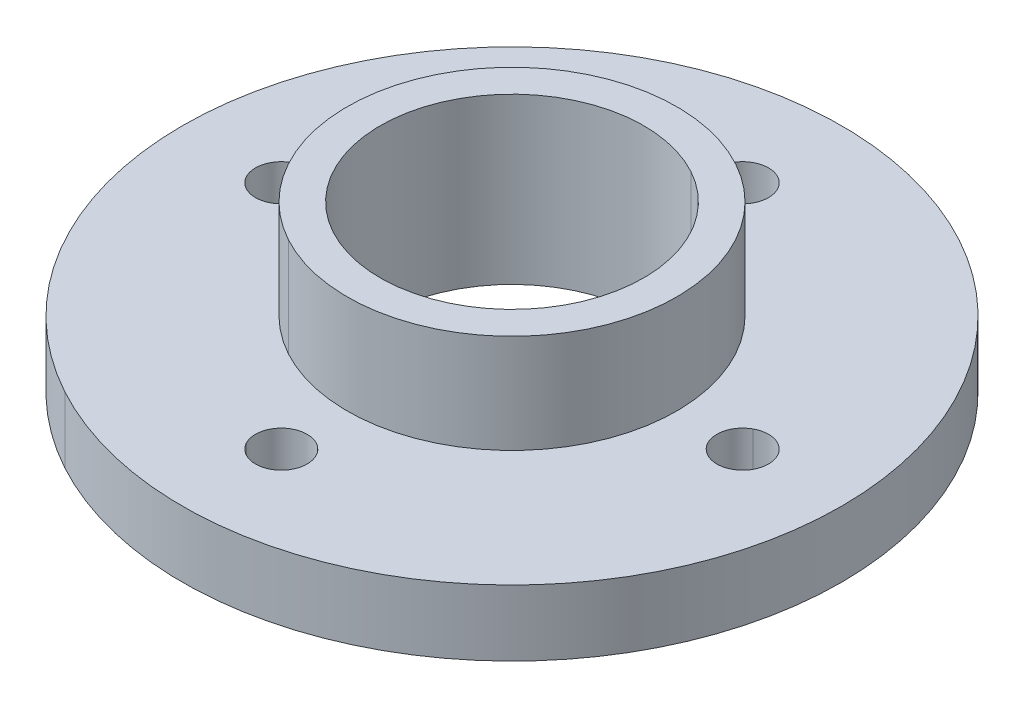
ISO-10303-21;
HEADER;
FILE_DESCRIPTION(('STEP AP214'),'2;1');
FILE_NAME('part.step','',(''),(''),'','','');
FILE_SCHEMA(('AUTOMOTIVE_DESIGN { 1 0 10303 214 1 1 1 1 }'));
ENDSEC;
DATA;
#1=APPLICATION_CONTEXT('core data for automotive mechanical design processes');
#2=APPLICATION_PROTOCOL_DEFINITION('international standard','automotive_design',2000,#1);
#3=PRODUCT_CONTEXT('',#1,'mechanical');
#4=PRODUCT('Part','Part','',(#3));
#5=PRODUCT_RELATED_PRODUCT_CATEGORY('part','',(#4));
#6=PRODUCT_DEFINITION_FORMATION('','',#4);
#7=PRODUCT_DEFINITION_CONTEXT('part definition',#1,'design');
#8=PRODUCT_DEFINITION('design','',#6,#7);
#9=PRODUCT_DEFINITION_SHAPE('','',#8);
#10=(LENGTH_UNIT() NAMED_UNIT(*) SI_UNIT(.MILLI.,.METRE.));
#11=(NAMED_UNIT(*) PLANE_ANGLE_UNIT() SI_UNIT($,.RADIAN.));
#12=(NAMED_UNIT(*) SI_UNIT($,.STERADIAN.) SOLID_ANGLE_UNIT());
#13=UNCERTAINTY_MEASURE_WITH_UNIT(LENGTH_MEASURE(1.E-05),#10,'distance_accuracy_value','');
#14=(GEOMETRIC_REPRESENTATION_CONTEXT(3) GLOBAL_UNCERTAINTY_ASSIGNED_CONTEXT((#13)) GLOBAL_UNIT_ASSIGNED_CONTEXT((#10,
#11,#12)) REPRESENTATION_CONTEXT('',''));
#15=CARTESIAN_POINT('',(0.,0.,0.));
#16=DIRECTION('',(0.,0.,1.));
#17=DIRECTION('',(1.,0.,0.));
#18=AXIS2_PLACEMENT_3D('',#15,#16,#17);
#19=CARTESIAN_POINT('',(7.,0.1,0.));
#20=DIRECTION('',(0.,-1.,0.));
#21=DIRECTION('',(0.,0.,-1.));
#22=AXIS2_PLACEMENT_3D('',#19,#20,#21);
#23=CYLINDRICAL_SURFACE('',#22,0.7835);
#24=DIRECTION('',(0.,-1.,0.));
#25=VECTOR('',#24,1.);
#26=CARTESIAN_POINT('',(6.62437009050361,1.34499999997,-0.687585937241108));
#27=LINE('',#26,#25);
#28=CARTESIAN_POINT('',(6.62437009050361,2.,-0.687585937241108));
#29=VERTEX_POINT('',#28);
#30=CARTESIAN_POINT('',(6.62437009050361,0.,-0.687585937241108));
#31=VERTEX_POINT('',#30);
#32=EDGE_CURVE('E11',#29,#31,#27,.T.);
#33=ORIENTED_EDGE('',*,*,#32,.F.);
#34=CARTESIAN_POINT('',(7.,2.,0.));
#35=DIRECTION('',(0.,-1.,0.));
#36=DIRECTION('',(1.,0.,0.));
#37=AXIS2_PLACEMENT_3D('',#34,#35,#36);
#38=CIRCLE('',#37,0.7835);
#39=CARTESIAN_POINT('',(7.37562990949639,2.,0.687585937241106));
#40=VERTEX_POINT('',#39);
#41=EDGE_CURVE('E295',#40,#29,#38,.T.);
#42=ORIENTED_EDGE('',*,*,#41,.F.);
#43=DIRECTION('',(0.,-1.,0.));
#44=VECTOR('',#43,1.);
#45=CARTESIAN_POINT('',(7.37562990949639,1.34499999997,0.687585937241106));
#46=LINE('',#45,#44);
#47=CARTESIAN_POINT('',(7.37562990949639,0.,0.687585937241106));
#48=VERTEX_POINT('',#47);
#49=EDGE_CURVE('E26',#40,#48,#46,.T.);
#50=ORIENTED_EDGE('',*,*,#49,.T.);
#51=CARTESIAN_POINT('',(7.,0.,0.));
#52=DIRECTION('',(0.,-1.,0.));
#53=DIRECTION('',(1.,0.,0.));
#54=AXIS2_PLACEMENT_3D('',#51,#52,#53);
#55=CIRCLE('',#54,0.7835);
#56=EDGE_CURVE('E189',#48,#31,#55,.T.);
#57=ORIENTED_EDGE('',*,*,#56,.T.);
#58=EDGE_LOOP('',(#33,#42,#50,#57));
#59=FACE_BOUND('',#58,.T.);
#60=ADVANCED_FACE('F18',(#59),#23,.F.);
#61=CARTESIAN_POINT('',(7.,0.1,0.));
#62=DIRECTION('',(0.,-1.,0.));
#63=DIRECTION('',(0.,0.,-1.));
#64=AXIS2_PLACEMENT_3D('',#61,#62,#63);
#65=CYLINDRICAL_SURFACE('',#64,0.7835);
#66=ORIENTED_EDGE('',*,*,#49,.F.);
#67=CARTESIAN_POINT('',(7.,2.,0.));
#68=DIRECTION('',(0.,-1.,0.));
#69=DIRECTION('',(1.,0.,0.));
#70=AXIS2_PLACEMENT_3D('',#67,#68,#69);
#71=CIRCLE('',#70,0.7835);
#72=EDGE_CURVE('E299',#29,#40,#71,.T.);
#73=ORIENTED_EDGE('',*,*,#72,.F.);
#74=ORIENTED_EDGE('',*,*,#32,.T.);
#75=CARTESIAN_POINT('',(7.,0.,0.));
#76=DIRECTION('',(0.,-1.,0.));
#77=DIRECTION('',(1.,0.,0.));
#78=AXIS2_PLACEMENT_3D('',#75,#76,#77);
#79=CIRCLE('',#78,0.7835);
#80=EDGE_CURVE('E165',#31,#48,#79,.T.);
#81=ORIENTED_EDGE('',*,*,#80,.T.);
#82=EDGE_LOOP('',(#66,#73,#74,#81));
#83=FACE_BOUND('',#82,.T.);
#84=ADVANCED_FACE('F313',(#83),#65,.F.);
#85=CARTESIAN_POINT('',(0.,0.1,-7.));
#86=DIRECTION('',(0.,-1.,0.));
#87=DIRECTION('',(-1.,0.,0.));
#88=AXIS2_PLACEMENT_3D('',#85,#86,#87);
#89=CYLINDRICAL_SURFACE('',#88,0.7835);
#90=DIRECTION('',(0.,-1.,0.));
#91=VECTOR('',#90,1.);
#92=CARTESIAN_POINT('',(-0.687585937241107,1.34499999997,-6.62437009050361));
#93=LINE('',#92,#91);
#94=CARTESIAN_POINT('',(-0.687585937241107,2.,-6.62437009050361));
#95=VERTEX_POINT('',#94);
#96=CARTESIAN_POINT('',(-0.687585937241108,0.,-6.62437009050361));
#97=VERTEX_POINT('',#96);
#98=EDGE_CURVE('E225',#95,#97,#93,.T.);
#99=ORIENTED_EDGE('',*,*,#98,.F.);
#100=CARTESIAN_POINT('',(0.,2.,-7.));
#101=DIRECTION('',(0.,-1.,0.));
#102=DIRECTION('',(1.,0.,0.));
#103=AXIS2_PLACEMENT_3D('',#100,#101,#102);
#104=CIRCLE('',#103,0.7835);
#105=CARTESIAN_POINT('',(0.687585937241107,2.,-7.37562990949639));
#106=VERTEX_POINT('',#105);
#107=EDGE_CURVE('E287',#106,#95,#104,.T.);
#108=ORIENTED_EDGE('',*,*,#107,.F.);
#109=DIRECTION('',(0.,-1.,0.));
#110=VECTOR('',#109,1.);
#111=CARTESIAN_POINT('',(0.687585937241107,1.34499999997,-7.37562990949639));
#112=LINE('',#111,#110);
#113=CARTESIAN_POINT('',(0.687585937241107,0.,-7.37562990949639));
#114=VERTEX_POINT('',#113);
#115=EDGE_CURVE('E222',#106,#114,#112,.T.);
#116=ORIENTED_EDGE('',*,*,#115,.T.);
#117=CARTESIAN_POINT('',(0.,0.,-7.));
#118=DIRECTION('',(0.,-1.,0.));
#119=DIRECTION('',(1.,0.,0.));
#120=AXIS2_PLACEMENT_3D('',#117,#118,#119);
#121=CIRCLE('',#120,0.7835);
#122=EDGE_CURVE('E190',#114,#97,#121,.T.);
#123=ORIENTED_EDGE('',*,*,#122,.T.);
#124=EDGE_LOOP('',(#99,#108,#116,#123));
#125=FACE_BOUND('',#124,.T.);
#126=ADVANCED_FACE('F390',(#125),#89,.F.);
#127=CARTESIAN_POINT('',(0.,0.1,-7.));
#128=DIRECTION('',(0.,-1.,0.));
#129=DIRECTION('',(-1.,0.,0.));
#130=AXIS2_PLACEMENT_3D('',#127,#128,#129);
#131=CYLINDRICAL_SURFACE('',#130,0.7835);
#132=ORIENTED_EDGE('',*,*,#115,.F.);
#133=CARTESIAN_POINT('',(0.,2.,-7.));
#134=DIRECTION('',(0.,-1.,0.));
#135=DIRECTION('',(1.,0.,0.));
#136=AXIS2_PLACEMENT_3D('',#133,#134,#135);
#137=CIRCLE('',#136,0.7835);
#138=EDGE_CURVE('E291',#95,#106,#137,.T.);
#139=ORIENTED_EDGE('',*,*,#138,.F.);
#140=ORIENTED_EDGE('',*,*,#98,.T.);
#141=CARTESIAN_POINT('',(0.,0.,-7.));
#142=DIRECTION('',(0.,-1.,0.));
#143=DIRECTION('',(1.,0.,0.));
#144=AXIS2_PLACEMENT_3D('',#141,#142,#143);
#145=CIRCLE('',#144,0.7835);
#146=EDGE_CURVE('E186',#97,#114,#145,.T.);
#147=ORIENTED_EDGE('',*,*,#146,.T.);
#148=EDGE_LOOP('',(#132,#139,#140,#147));
#149=FACE_BOUND('',#148,.T.);
#150=ADVANCED_FACE('F395',(#149),#131,.F.);
#151=CARTESIAN_POINT('',(-7.,0.1,0.));
#152=DIRECTION('',(0.,-1.,0.));
#153=DIRECTION('',(0.,0.,1.));
#154=AXIS2_PLACEMENT_3D('',#151,#152,#153);
#155=CYLINDRICAL_SURFACE('',#154,0.7835);
#156=DIRECTION('',(0.,-1.,0.));
#157=VECTOR('',#156,1.);
#158=CARTESIAN_POINT('',(-6.62437009050361,1.34499999997,0.687585937241107));
#159=LINE('',#158,#157);
#160=CARTESIAN_POINT('',(-6.62437009050361,2.,0.687585937241106));
#161=VERTEX_POINT('',#160);
#162=CARTESIAN_POINT('',(-6.62437009050361,0.,0.687585937241107));
#163=VERTEX_POINT('',#162);
#164=EDGE_CURVE('E226',#161,#163,#159,.T.);
#165=ORIENTED_EDGE('',*,*,#164,.F.);
#166=CARTESIAN_POINT('',(-7.,2.,0.));
#167=DIRECTION('',(0.,-1.,0.));
#168=DIRECTION('',(1.,0.,0.));
#169=AXIS2_PLACEMENT_3D('',#166,#167,#168);
#170=CIRCLE('',#169,0.7835);
#171=CARTESIAN_POINT('',(-7.37562990949639,2.,-0.687585937241108));
#172=VERTEX_POINT('',#171);
#173=EDGE_CURVE('E204',#172,#161,#170,.T.);
#174=ORIENTED_EDGE('',*,*,#173,.F.);
#175=DIRECTION('',(0.,-1.,0.));
#176=VECTOR('',#175,1.);
#177=CARTESIAN_POINT('',(-7.37562990949639,1.34499999997,-0.687585937241107));
#178=LINE('',#177,#176);
#179=CARTESIAN_POINT('',(-7.37562990949639,0.,-0.687585937241107));
#180=VERTEX_POINT('',#179);
#181=EDGE_CURVE('E302',#172,#180,#178,.T.);
#182=ORIENTED_EDGE('',*,*,#181,.T.);
#183=CARTESIAN_POINT('',(-7.,0.,0.));
#184=DIRECTION('',(0.,-1.,0.));
#185=DIRECTION('',(1.,0.,0.));
#186=AXIS2_PLACEMENT_3D('',#183,#184,#185);
#187=CIRCLE('',#186,0.7835);
#188=EDGE_CURVE('E196',#180,#163,#187,.T.);
#189=ORIENTED_EDGE('',*,*,#188,.T.);
#190=EDGE_LOOP('',(#165,#174,#182,#189));
#191=FACE_BOUND('',#190,.T.);
#192=ADVANCED_FACE('F379',(#191),#155,.F.);
#193=CARTESIAN_POINT('',(-7.,0.1,0.));
#194=DIRECTION('',(0.,-1.,0.));
#195=DIRECTION('',(0.,0.,1.));
#196=AXIS2_PLACEMENT_3D('',#193,#194,#195);
#197=CYLINDRICAL_SURFACE('',#196,0.7835);
#198=ORIENTED_EDGE('',*,*,#181,.F.);
#199=CARTESIAN_POINT('',(-7.,2.,0.));
#200=DIRECTION('',(0.,-1.,0.));
#201=DIRECTION('',(1.,0.,0.));
#202=AXIS2_PLACEMENT_3D('',#199,#200,#201);
#203=CIRCLE('',#202,0.7835);
#204=EDGE_CURVE('E208',#161,#172,#203,.T.);
#205=ORIENTED_EDGE('',*,*,#204,.F.);
#206=ORIENTED_EDGE('',*,*,#164,.T.);
#207=CARTESIAN_POINT('',(-7.,0.,0.));
#208=DIRECTION('',(0.,-1.,0.));
#209=DIRECTION('',(1.,0.,0.));
#210=AXIS2_PLACEMENT_3D('',#207,#208,#209);
#211=CIRCLE('',#210,0.7835);
#212=EDGE_CURVE('E192',#163,#180,#211,.T.);
#213=ORIENTED_EDGE('',*,*,#212,.T.);
#214=EDGE_LOOP('',(#198,#205,#206,#213));
#215=FACE_BOUND('',#214,.T.);
#216=ADVANCED_FACE('F368',(#215),#197,.F.);
#217=CARTESIAN_POINT('',(0.,2.,10.));
#218=DIRECTION('',(0.,-1.,0.));
#219=DIRECTION('',(1.,0.,0.));
#220=AXIS2_PLACEMENT_3D('',#217,#218,#219);
#221=PLANE('',#220);
#222=ORIENTED_EDGE('',*,*,#41,.T.);
#223=ORIENTED_EDGE('',*,*,#72,.T.);
#224=EDGE_LOOP('',(#222,#223));
#225=FACE_BOUND('',#224,.T.);
#226=ORIENTED_EDGE('',*,*,#107,.T.);
#227=ORIENTED_EDGE('',*,*,#138,.T.);
#228=EDGE_LOOP('',(#226,#227));
#229=FACE_BOUND('',#228,.T.);
#230=ORIENTED_EDGE('',*,*,#173,.T.);
#231=ORIENTED_EDGE('',*,*,#204,.T.);
#232=EDGE_LOOP('',(#230,#231));
#233=FACE_BOUND('',#232,.T.);
#234=CARTESIAN_POINT('',(0.,2.,0.));
#235=DIRECTION('',(0.,-1.,0.));
#236=DIRECTION('',(1.,0.,0.));
#237=AXIS2_PLACEMENT_3D('',#234,#235,#236);
#238=CIRCLE('',#237,5.);
#239=CARTESIAN_POINT('',(2.39712769302102,2.,-4.38791280945186));
#240=VERTEX_POINT('',#239);
#241=CARTESIAN_POINT('',(-2.39712769302102,2.,4.38791280945186));
#242=VERTEX_POINT('',#241);
#243=EDGE_CURVE('E265',#240,#242,#238,.T.);
#244=ORIENTED_EDGE('',*,*,#243,.T.);
#245=CARTESIAN_POINT('',(0.,2.,0.));
#246=DIRECTION('',(0.,-1.,0.));
#247=DIRECTION('',(1.,0.,0.));
#248=AXIS2_PLACEMENT_3D('',#245,#246,#247);
#249=CIRCLE('',#248,5.);
#250=EDGE_CURVE('E253',#242,#240,#249,.T.);
#251=ORIENTED_EDGE('',*,*,#250,.T.);
#252=EDGE_LOOP('',(#244,#251));
#253=FACE_BOUND('',#252,.T.);
#254=CARTESIAN_POINT('',(0.,2.,7.));
#255=DIRECTION('',(0.,-1.,0.));
#256=DIRECTION('',(1.,0.,0.));
#257=AXIS2_PLACEMENT_3D('',#254,#255,#256);
#258=CIRCLE('',#257,0.7835);
#259=CARTESIAN_POINT('',(0.687585937241106,2.,6.62437009050361));
#260=VERTEX_POINT('',#259);
#261=CARTESIAN_POINT('',(-0.687585937241108,2.,7.37562990949639));
#262=VERTEX_POINT('',#261);
#263=EDGE_CURVE('E167',#260,#262,#258,.T.);
#264=ORIENTED_EDGE('',*,*,#263,.T.);
#265=CARTESIAN_POINT('',(0.,2.,7.));
#266=DIRECTION('',(0.,-1.,0.));
#267=DIRECTION('',(1.,0.,0.));
#268=AXIS2_PLACEMENT_3D('',#265,#266,#267);
#269=CIRCLE('',#268,0.7835);
#270=EDGE_CURVE('E153',#262,#260,#269,.T.);
#271=ORIENTED_EDGE('',*,*,#270,.T.);
#272=EDGE_LOOP('',(#264,#271));
#273=FACE_BOUND('',#272,.T.);
#274=CARTESIAN_POINT('',(0.,2.,0.));
#275=DIRECTION('',(0.,-1.,0.));
#276=DIRECTION('',(1.,0.,0.));
#277=AXIS2_PLACEMENT_3D('',#274,#275,#276);
#278=CIRCLE('',#277,10.);
#279=CARTESIAN_POINT('',(-4.79425538604203,2.,8.77582561890373));
#280=VERTEX_POINT('',#279);
#281=CARTESIAN_POINT('',(4.79425538604203,2.,-8.77582561890373));
#282=VERTEX_POINT('',#281);
#283=EDGE_CURVE('E246',#280,#282,#278,.T.);
#284=ORIENTED_EDGE('',*,*,#283,.F.);
#285=CARTESIAN_POINT('',(0.,2.,0.));
#286=DIRECTION('',(0.,-1.,0.));
#287=DIRECTION('',(1.,0.,0.));
#288=AXIS2_PLACEMENT_3D('',#285,#286,#287);
#289=CIRCLE('',#288,10.);
#290=EDGE_CURVE('E242',#282,#280,#289,.T.);
#291=ORIENTED_EDGE('',*,*,#290,.F.);
#292=EDGE_LOOP('',(#284,#291));
#293=FACE_BOUND('',#292,.T.);
#294=ADVANCED_FACE('F169',(#225,#229,#233,#253,#273,#293),#221,.F.);
#295=CARTESIAN_POINT('',(0.,2.5,0.));
#296=DIRECTION('',(0.,1.,0.));
#297=DIRECTION('',(1.,0.,0.));
#298=AXIS2_PLACEMENT_3D('',#295,#296,#297);
#299=CYLINDRICAL_SURFACE('',#298,4.);
#300=DIRECTION('',(0.,1.,0.));
#301=VECTOR('',#300,1.);
#302=CARTESIAN_POINT('',(1.91770215441681,2.5,-3.51033024756149));
#303=LINE('',#302,#301);
#304=CARTESIAN_POINT('',(1.91770215441681,0.,-3.51033024756149));
#305=VERTEX_POINT('',#304);
#306=CARTESIAN_POINT('',(1.91770215441681,5.,-3.51033024756149));
#307=VERTEX_POINT('',#306);
#308=EDGE_CURVE('E209',#305,#307,#303,.T.);
#309=ORIENTED_EDGE('',*,*,#308,.T.);
#310=CARTESIAN_POINT('',(0.,5.,0.));
#311=DIRECTION('',(0.,-1.,0.));
#312=DIRECTION('',(1.,0.,0.));
#313=AXIS2_PLACEMENT_3D('',#310,#311,#312);
#314=CIRCLE('',#313,4.);
#315=CARTESIAN_POINT('',(-1.91770215441681,5.,3.51033024756149));
#316=VERTEX_POINT('',#315);
#317=EDGE_CURVE('E275',#316,#307,#314,.T.);
#318=ORIENTED_EDGE('',*,*,#317,.F.);
#319=DIRECTION('',(0.,1.,0.));
#320=VECTOR('',#319,1.);
#321=CARTESIAN_POINT('',(-1.91770215441681,2.5,3.51033024756149));
#322=LINE('',#321,#320);
#323=CARTESIAN_POINT('',(-1.91770215441681,0.,3.51033024756149));
#324=VERTEX_POINT('',#323);
#325=EDGE_CURVE('E279',#324,#316,#322,.T.);
#326=ORIENTED_EDGE('',*,*,#325,.F.);
#327=CARTESIAN_POINT('',(0.,0.,0.));
#328=DIRECTION('',(0.,-1.,0.));
#329=DIRECTION('',(1.,0.,0.));
#330=AXIS2_PLACEMENT_3D('',#327,#328,#329);
#331=CIRCLE('',#330,4.);
#332=EDGE_CURVE('E185',#324,#305,#331,.T.);
#333=ORIENTED_EDGE('',*,*,#332,.T.);
#334=EDGE_LOOP('',(#309,#318,#326,#333));
#335=FACE_BOUND('',#334,.T.);
#336=ADVANCED_FACE('F367',(#335),#299,.F.);
#337=CARTESIAN_POINT('',(0.,2.5,0.));
#338=DIRECTION('',(0.,1.,0.));
#339=DIRECTION('',(1.,0.,0.));
#340=AXIS2_PLACEMENT_3D('',#337,#338,#339);
#341=CYLINDRICAL_SURFACE('',#340,4.);
#342=ORIENTED_EDGE('',*,*,#325,.T.);
#343=CARTESIAN_POINT('',(0.,5.,0.));
#344=DIRECTION('',(0.,-1.,0.));
#345=DIRECTION('',(1.,0.,0.));
#346=AXIS2_PLACEMENT_3D('',#343,#344,#345);
#347=CIRCLE('',#346,4.);
#348=EDGE_CURVE('E271',#307,#316,#347,.T.);
#349=ORIENTED_EDGE('',*,*,#348,.F.);
#350=ORIENTED_EDGE('',*,*,#308,.F.);
#351=CARTESIAN_POINT('',(0.,0.,0.));
#352=DIRECTION('',(0.,-1.,0.));
#353=DIRECTION('',(1.,0.,0.));
#354=AXIS2_PLACEMENT_3D('',#351,#352,#353);
#355=CIRCLE('',#354,4.);
#356=EDGE_CURVE('E217',#305,#324,#355,.T.);
#357=ORIENTED_EDGE('',*,*,#356,.T.);
#358=EDGE_LOOP('',(#342,#349,#350,#357));
#359=FACE_BOUND('',#358,.T.);
#360=ADVANCED_FACE('F376',(#359),#341,.F.);
#361=CARTESIAN_POINT('',(0.,5.,5.));
#362=DIRECTION('',(0.,-1.,0.));
#363=DIRECTION('',(1.,0.,0.));
#364=AXIS2_PLACEMENT_3D('',#361,#362,#363);
#365=PLANE('',#364);
#366=ORIENTED_EDGE('',*,*,#348,.T.);
#367=ORIENTED_EDGE('',*,*,#317,.T.);
#368=EDGE_LOOP('',(#366,#367));
#369=FACE_BOUND('',#368,.T.);
#370=CARTESIAN_POINT('',(0.,5.,0.));
#371=DIRECTION('',(0.,-1.,0.));
#372=DIRECTION('',(1.,0.,0.));
#373=AXIS2_PLACEMENT_3D('',#370,#371,#372);
#374=CIRCLE('',#373,5.);
#375=CARTESIAN_POINT('',(-2.39712769302102,5.,4.38791280945186));
#376=VERTEX_POINT('',#375);
#377=CARTESIAN_POINT('',(2.39712769302102,5.,-4.38791280945186));
#378=VERTEX_POINT('',#377);
#379=EDGE_CURVE('E261',#376,#378,#374,.T.);
#380=ORIENTED_EDGE('',*,*,#379,.F.);
#381=CARTESIAN_POINT('',(0.,5.,0.));
#382=DIRECTION('',(0.,-1.,0.));
#383=DIRECTION('',(1.,0.,0.));
#384=AXIS2_PLACEMENT_3D('',#381,#382,#383);
#385=CIRCLE('',#384,5.);
#386=EDGE_CURVE('E268',#378,#376,#385,.T.);
#387=ORIENTED_EDGE('',*,*,#386,.F.);
#388=EDGE_LOOP('',(#380,#387));
#389=FACE_BOUND('',#388,.T.);
#390=ADVANCED_FACE('F407',(#369,#389),#365,.F.);
#391=CARTESIAN_POINT('',(0.,2.5,0.));
#392=DIRECTION('',(0.,1.,0.));
#393=DIRECTION('',(1.,0.,0.));
#394=AXIS2_PLACEMENT_3D('',#391,#392,#393);
#395=CYLINDRICAL_SURFACE('',#394,5.);
#396=DIRECTION('',(0.,-1.,0.));
#397=VECTOR('',#396,1.);
#398=CARTESIAN_POINT('',(-2.39712769302102,3.5,4.38791280945186));
#399=LINE('',#398,#397);
#400=EDGE_CURVE('E257',#376,#242,#399,.T.);
#401=ORIENTED_EDGE('',*,*,#400,.T.);
#402=ORIENTED_EDGE('',*,*,#243,.F.);
#403=DIRECTION('',(0.,-1.,0.));
#404=VECTOR('',#403,1.);
#405=CARTESIAN_POINT('',(2.39712769302102,3.5,-4.38791280945186));
#406=LINE('',#405,#404);
#407=EDGE_CURVE('E249',#378,#240,#406,.T.);
#408=ORIENTED_EDGE('',*,*,#407,.F.);
#409=ORIENTED_EDGE('',*,*,#386,.T.);
#410=EDGE_LOOP('',(#401,#402,#408,#409));
#411=FACE_BOUND('',#410,.T.);
#412=ADVANCED_FACE('F404',(#411),#395,.T.);
#413=CARTESIAN_POINT('',(0.,2.5,0.));
#414=DIRECTION('',(0.,1.,0.));
#415=DIRECTION('',(1.,0.,0.));
#416=AXIS2_PLACEMENT_3D('',#413,#414,#415);
#417=CYLINDRICAL_SURFACE('',#416,5.);
#418=ORIENTED_EDGE('',*,*,#407,.T.);
#419=ORIENTED_EDGE('',*,*,#250,.F.);
#420=ORIENTED_EDGE('',*,*,#400,.F.);
#421=ORIENTED_EDGE('',*,*,#379,.T.);
#422=EDGE_LOOP('',(#418,#419,#420,#421));
#423=FACE_BOUND('',#422,.T.);
#424=ADVANCED_FACE('F400',(#423),#417,.T.);
#425=CARTESIAN_POINT('',(0.,2.5,0.));
#426=DIRECTION('',(0.,1.,0.));
#427=DIRECTION('',(1.,0.,0.));
#428=AXIS2_PLACEMENT_3D('',#425,#426,#427);
#429=CYLINDRICAL_SURFACE('',#428,10.);
#430=DIRECTION('',(0.,-1.,0.));
#431=VECTOR('',#430,1.);
#432=CARTESIAN_POINT('',(4.79425538604203,1.,-8.77582561890373));
#433=LINE('',#432,#431);
#434=CARTESIAN_POINT('',(4.79425538604203,0.,-8.77582561890373));
#435=VERTEX_POINT('',#434);
#436=EDGE_CURVE('E239',#282,#435,#433,.T.);
#437=ORIENTED_EDGE('',*,*,#436,.T.);
#438=CARTESIAN_POINT('',(0.,0.,0.));
#439=DIRECTION('',(0.,-1.,0.));
#440=DIRECTION('',(1.,0.,0.));
#441=AXIS2_PLACEMENT_3D('',#438,#439,#440);
#442=CIRCLE('',#441,10.);
#443=CARTESIAN_POINT('',(-4.79425538604203,0.,8.77582561890373));
#444=VERTEX_POINT('',#443);
#445=EDGE_CURVE('E213',#444,#435,#442,.T.);
#446=ORIENTED_EDGE('',*,*,#445,.F.);
#447=DIRECTION('',(0.,-1.,0.));
#448=VECTOR('',#447,1.);
#449=CARTESIAN_POINT('',(-4.79425538604203,1.,8.77582561890373));
#450=LINE('',#449,#448);
#451=EDGE_CURVE('E164',#280,#444,#450,.T.);
#452=ORIENTED_EDGE('',*,*,#451,.F.);
#453=ORIENTED_EDGE('',*,*,#283,.T.);
#454=EDGE_LOOP('',(#437,#446,#452,#453));
#455=FACE_BOUND('',#454,.T.);
#456=ADVANCED_FACE('F361',(#455),#429,.T.);
#457=CARTESIAN_POINT('',(0.,2.5,0.));
#458=DIRECTION('',(0.,1.,0.));
#459=DIRECTION('',(1.,0.,0.));
#460=AXIS2_PLACEMENT_3D('',#457,#458,#459);
#461=CYLINDRICAL_SURFACE('',#460,10.);
#462=ORIENTED_EDGE('',*,*,#451,.T.);
#463=CARTESIAN_POINT('',(0.,0.,0.));
#464=DIRECTION('',(0.,-1.,0.));
#465=DIRECTION('',(1.,0.,0.));
#466=AXIS2_PLACEMENT_3D('',#463,#464,#465);
#467=CIRCLE('',#466,10.);
#468=EDGE_CURVE('E201',#435,#444,#467,.T.);
#469=ORIENTED_EDGE('',*,*,#468,.F.);
#470=ORIENTED_EDGE('',*,*,#436,.F.);
#471=ORIENTED_EDGE('',*,*,#290,.T.);
#472=EDGE_LOOP('',(#462,#469,#470,#471));
#473=FACE_BOUND('',#472,.T.);
#474=ADVANCED_FACE('F356',(#473),#461,.T.);
#475=CARTESIAN_POINT('',(0.,0.1,7.));
#476=DIRECTION('',(0.,-1.,0.));
#477=DIRECTION('',(1.,0.,0.));
#478=AXIS2_PLACEMENT_3D('',#475,#476,#477);
#479=CYLINDRICAL_SURFACE('',#478,0.7835);
#480=DIRECTION('',(0.,-1.,0.));
#481=VECTOR('',#480,1.);
#482=CARTESIAN_POINT('',(0.687585937241106,1.34499999997,6.62437009050361));
#483=LINE('',#482,#481);
#484=CARTESIAN_POINT('',(0.687585937241106,0.,6.62437009050361));
#485=VERTEX_POINT('',#484);
#486=EDGE_CURVE('E160',#260,#485,#483,.T.);
#487=ORIENTED_EDGE('',*,*,#486,.F.);
#488=ORIENTED_EDGE('',*,*,#270,.F.);
#489=DIRECTION('',(0.,-1.,0.));
#490=VECTOR('',#489,1.);
#491=CARTESIAN_POINT('',(-0.687585937241108,1.34499999997,7.37562990949639));
#492=LINE('',#491,#490);
#493=CARTESIAN_POINT('',(-0.687585937241108,0.,7.37562990949639));
#494=VERTEX_POINT('',#493);
#495=EDGE_CURVE('E158',#262,#494,#492,.T.);
#496=ORIENTED_EDGE('',*,*,#495,.T.);
#497=CARTESIAN_POINT('',(0.,0.,7.));
#498=DIRECTION('',(0.,-1.,0.));
#499=DIRECTION('',(1.,0.,0.));
#500=AXIS2_PLACEMENT_3D('',#497,#498,#499);
#501=CIRCLE('',#500,0.7835);
#502=EDGE_CURVE('E221',#494,#485,#501,.T.);
#503=ORIENTED_EDGE('',*,*,#502,.T.);
#504=EDGE_LOOP('',(#487,#488,#496,#503));
#505=FACE_BOUND('',#504,.T.);
#506=ADVANCED_FACE('F156',(#505),#479,.F.);
#507=CARTESIAN_POINT('',(0.,0.,4.));
#508=DIRECTION('',(0.,-1.,0.));
#509=DIRECTION('',(1.,0.,0.));
#510=AXIS2_PLACEMENT_3D('',#507,#508,#509);
#511=PLANE('',#510);
#512=ORIENTED_EDGE('',*,*,#56,.F.);
#513=ORIENTED_EDGE('',*,*,#80,.F.);
#514=EDGE_LOOP('',(#512,#513));
#515=FACE_BOUND('',#514,.T.);
#516=ORIENTED_EDGE('',*,*,#122,.F.);
#517=ORIENTED_EDGE('',*,*,#146,.F.);
#518=EDGE_LOOP('',(#516,#517));
#519=FACE_BOUND('',#518,.T.);
#520=ORIENTED_EDGE('',*,*,#188,.F.);
#521=ORIENTED_EDGE('',*,*,#212,.F.);
#522=EDGE_LOOP('',(#520,#521));
#523=FACE_BOUND('',#522,.T.);
#524=ORIENTED_EDGE('',*,*,#332,.F.);
#525=ORIENTED_EDGE('',*,*,#356,.F.);
#526=EDGE_LOOP('',(#524,#525));
#527=FACE_BOUND('',#526,.T.);
#528=ORIENTED_EDGE('',*,*,#502,.F.);
#529=CARTESIAN_POINT('',(0.,0.,7.));
#530=DIRECTION('',(0.,-1.,0.));
#531=DIRECTION('',(1.,0.,0.));
#532=AXIS2_PLACEMENT_3D('',#529,#530,#531);
#533=CIRCLE('',#532,0.7835);
#534=EDGE_CURVE('E178',#485,#494,#533,.T.);
#535=ORIENTED_EDGE('',*,*,#534,.F.);
#536=EDGE_LOOP('',(#528,#535));
#537=FACE_BOUND('',#536,.T.);
#538=ORIENTED_EDGE('',*,*,#468,.T.);
#539=ORIENTED_EDGE('',*,*,#445,.T.);
#540=EDGE_LOOP('',(#538,#539));
#541=FACE_BOUND('',#540,.T.);
#542=ADVANCED_FACE('F316',(#515,#519,#523,#527,#537,#541),#511,.T.);
#543=CARTESIAN_POINT('',(0.,0.1,7.));
#544=DIRECTION('',(0.,-1.,0.));
#545=DIRECTION('',(1.,0.,0.));
#546=AXIS2_PLACEMENT_3D('',#543,#544,#545);
#547=CYLINDRICAL_SURFACE('',#546,0.7835);
#548=ORIENTED_EDGE('',*,*,#495,.F.);
#549=ORIENTED_EDGE('',*,*,#263,.F.);
#550=ORIENTED_EDGE('',*,*,#486,.T.);
#551=ORIENTED_EDGE('',*,*,#534,.T.);
#552=EDGE_LOOP('',(#548,#549,#550,#551));
#553=FACE_BOUND('',#552,.T.);
#554=ADVANCED_FACE('F176',(#553),#547,.F.);
#555=CLOSED_SHELL('',(#60,#84,#126,#150,#192,#216,#294,#336,#360,#390,#412,#424,#456,#474,#506,
#542,#554));
#556=MANIFOLD_SOLID_BREP('B1',#555);
#557=ADVANCED_BREP_SHAPE_REPRESENTATION('',(#18,#556),#14);
#558=SHAPE_DEFINITION_REPRESENTATION(#9,#557);
ENDSEC;
END-ISO-10303-21;
